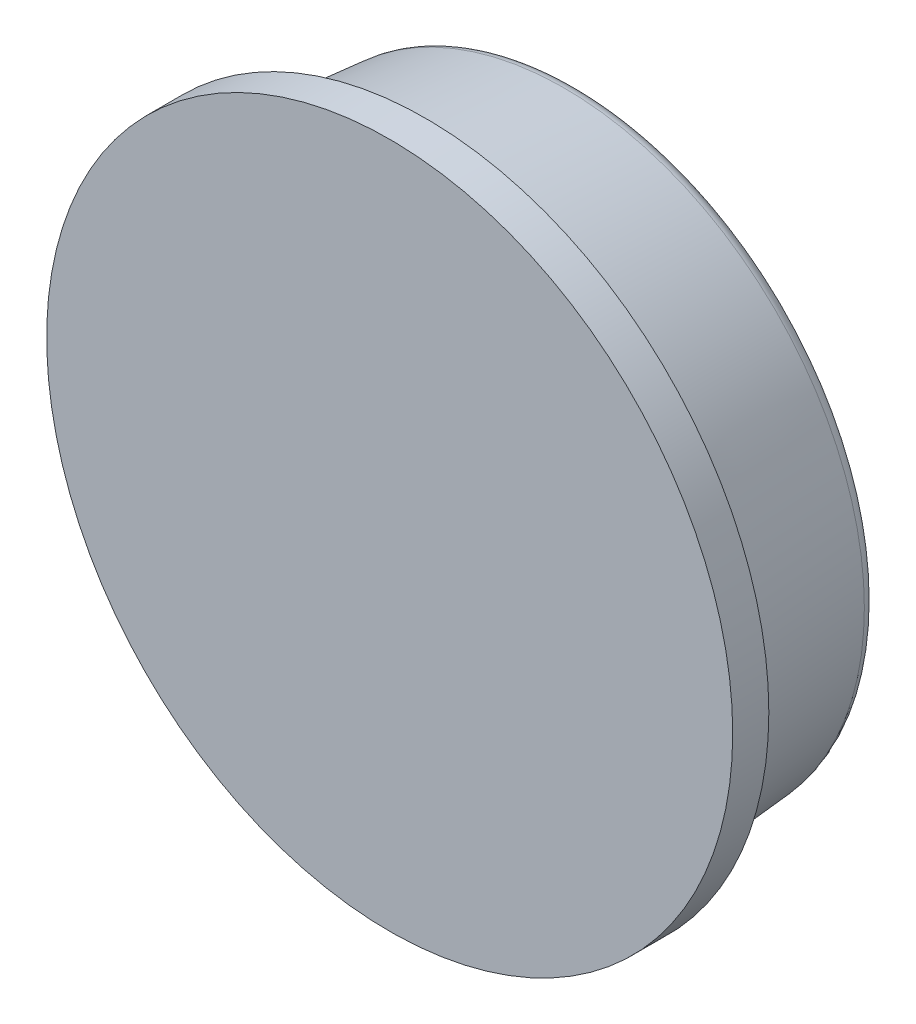
ISO-10303-21;
HEADER;
FILE_DESCRIPTION(('STEP AP214'),'2;1');
FILE_NAME('part.step','',(''),(''),'','','');
FILE_SCHEMA(('AUTOMOTIVE_DESIGN { 1 0 10303 214 1 1 1 1 }'));
ENDSEC;
DATA;
#1=APPLICATION_CONTEXT('core data for automotive mechanical design processes');
#2=APPLICATION_PROTOCOL_DEFINITION('international standard','automotive_design',2000,#1);
#3=PRODUCT_CONTEXT('',#1,'mechanical');
#4=PRODUCT('Part','Part','',(#3));
#5=PRODUCT_RELATED_PRODUCT_CATEGORY('part','',(#4));
#6=PRODUCT_DEFINITION_FORMATION('','',#4);
#7=PRODUCT_DEFINITION_CONTEXT('part definition',#1,'design');
#8=PRODUCT_DEFINITION('design','',#6,#7);
#9=PRODUCT_DEFINITION_SHAPE('','',#8);
#10=(LENGTH_UNIT() NAMED_UNIT(*) SI_UNIT(.MILLI.,.METRE.));
#11=(NAMED_UNIT(*) PLANE_ANGLE_UNIT() SI_UNIT($,.RADIAN.));
#12=(NAMED_UNIT(*) SI_UNIT($,.STERADIAN.) SOLID_ANGLE_UNIT());
#13=UNCERTAINTY_MEASURE_WITH_UNIT(LENGTH_MEASURE(1.E-05),#10,'distance_accuracy_value','');
#14=(GEOMETRIC_REPRESENTATION_CONTEXT(3) GLOBAL_UNCERTAINTY_ASSIGNED_CONTEXT((#13)) GLOBAL_UNIT_ASSIGNED_CONTEXT((#10,
#11,#12)) REPRESENTATION_CONTEXT('',''));
#15=CARTESIAN_POINT('',(0.,0.,0.));
#16=DIRECTION('',(0.,0.,1.));
#17=DIRECTION('',(1.,0.,0.));
#18=AXIS2_PLACEMENT_3D('',#15,#16,#17);
#19=CARTESIAN_POINT('',(0.,0.,2.667));
#20=DIRECTION('',(0.,0.,1.));
#21=DIRECTION('',(1.,0.,0.));
#22=AXIS2_PLACEMENT_3D('',#19,#20,#21);
#23=CYLINDRICAL_SURFACE('',#22,6.0325);
#24=CARTESIAN_POINT('',(0.,0.,2.667));
#25=DIRECTION('',(0.,0.,1.));
#26=DIRECTION('',(1.,0.,0.));
#27=AXIS2_PLACEMENT_3D('',#24,#25,#26);
#28=CIRCLE('',#27,6.0325);
#29=CARTESIAN_POINT('',(6.0325,0.,2.667));
#30=VERTEX_POINT('',#29);
#31=EDGE_CURVE('E54',#30,#30,#28,.T.);
#32=ORIENTED_EDGE('',*,*,#31,.T.);
#33=EDGE_LOOP('',(#32));
#34=FACE_BOUND('',#33,.T.);
#35=CARTESIAN_POINT('',(0.,0.,3.302));
#36=DIRECTION('',(0.,0.,1.));
#37=DIRECTION('',(1.,0.,0.));
#38=AXIS2_PLACEMENT_3D('',#35,#36,#37);
#39=CIRCLE('',#38,6.0325);
#40=CARTESIAN_POINT('',(6.0325,0.,3.302));
#41=VERTEX_POINT('',#40);
#42=EDGE_CURVE('E58',#41,#41,#39,.T.);
#43=ORIENTED_EDGE('',*,*,#42,.F.);
#44=EDGE_LOOP('',(#43));
#45=FACE_BOUND('',#44,.T.);
#46=ADVANCED_FACE('F43',(#34,#45),#23,.T.);
#47=CARTESIAN_POINT('',(0.,0.,2.667));
#48=DIRECTION('',(0.,0.,1.));
#49=DIRECTION('',(1.,0.,0.));
#50=AXIS2_PLACEMENT_3D('',#47,#48,#49);
#51=PLANE('',#50);
#52=CARTESIAN_POINT('',(0.,0.,2.667));
#53=DIRECTION('',(0.,0.,-1.));
#54=DIRECTION('',(-1.,0.,0.));
#55=AXIS2_PLACEMENT_3D('',#52,#53,#54);
#56=CIRCLE('',#55,5.4864);
#57=CARTESIAN_POINT('',(-5.4864,0.,2.667));
#58=VERTEX_POINT('',#57);
#59=EDGE_CURVE('E62',#58,#58,#56,.T.);
#60=ORIENTED_EDGE('',*,*,#59,.F.);
#61=EDGE_LOOP('',(#60));
#62=FACE_BOUND('',#61,.T.);
#63=ORIENTED_EDGE('',*,*,#31,.F.);
#64=EDGE_LOOP('',(#63));
#65=FACE_BOUND('',#64,.T.);
#66=ADVANCED_FACE('F69',(#62,#65),#51,.F.);
#67=CARTESIAN_POINT('',(0.,0.,3.302));
#68=DIRECTION('',(0.,0.,1.));
#69=DIRECTION('',(1.,0.,0.));
#70=AXIS2_PLACEMENT_3D('',#67,#68,#69);
#71=PLANE('',#70);
#72=ORIENTED_EDGE('',*,*,#42,.T.);
#73=EDGE_LOOP('',(#72));
#74=FACE_BOUND('',#73,.T.);
#75=ADVANCED_FACE('F72',(#74),#71,.T.);
#76=CARTESIAN_POINT('',(0.,0.,0.));
#77=DIRECTION('',(0.,0.,1.));
#78=DIRECTION('',(1.,0.,0.));
#79=AXIS2_PLACEMENT_3D('',#76,#77,#78);
#80=PLANE('',#79);
#81=CARTESIAN_POINT('',(0.,0.,0.));
#82=DIRECTION('',(0.,0.,1.));
#83=DIRECTION('',(1.,0.,0.));
#84=AXIS2_PLACEMENT_3D('',#81,#82,#83);
#85=CIRCLE('',#84,5.02464007486608);
#86=CARTESIAN_POINT('',(5.02464007486608,0.,0.));
#87=VERTEX_POINT('',#86);
#88=EDGE_CURVE('E11',#87,#87,#85,.F.);
#89=ORIENTED_EDGE('',*,*,#88,.T.);
#90=EDGE_LOOP('',(#89));
#91=FACE_BOUND('',#90,.T.);
#92=ADVANCED_FACE('F81',(#91),#80,.F.);
#93=CARTESIAN_POINT('',(0.,0.,0.));
#94=DIRECTION('',(0.,0.,1.));
#95=DIRECTION('',(1.,0.,0.));
#96=AXIS2_PLACEMENT_3D('',#93,#94,#95);
#97=CONICAL_SURFACE('',#96,5.2578,0.0855052936782046);
#98=CARTESIAN_POINT('',(0.,0.,0.232308110098005));
#99=DIRECTION('',(0.,0.,1.));
#100=DIRECTION('',(1.,0.,0.));
#101=AXIS2_PLACEMENT_3D('',#98,#99,#100);
#102=CIRCLE('',#101,5.27771212372269);
#103=CARTESIAN_POINT('',(5.27771212372269,0.,0.232308110098005));
#104=VERTEX_POINT('',#103);
#105=EDGE_CURVE('E50',#104,#104,#102,.T.);
#106=ORIENTED_EDGE('',*,*,#105,.T.);
#107=EDGE_LOOP('',(#106));
#108=FACE_BOUND('',#107,.T.);
#109=ORIENTED_EDGE('',*,*,#59,.T.);
#110=EDGE_LOOP('',(#109));
#111=FACE_BOUND('',#110,.T.);
#112=ADVANCED_FACE('F67',(#108,#111),#97,.T.);
#113=CARTESIAN_POINT('',(0.,0.,0.254));
#114=DIRECTION('',(0.,0.,1.));
#115=DIRECTION('',(1.,0.,0.));
#116=AXIS2_PLACEMENT_3D('',#113,#114,#115);
#117=TOROIDAL_SURFACE('',#116,5.02464007486608,0.254);
#118=ORIENTED_EDGE('',*,*,#88,.F.);
#119=EDGE_LOOP('',(#118));
#120=FACE_BOUND('',#119,.T.);
#121=ORIENTED_EDGE('',*,*,#105,.F.);
#122=EDGE_LOOP('',(#121));
#123=FACE_BOUND('',#122,.T.);
#124=ADVANCED_FACE('F45',(#120,#123),#117,.T.);
#125=CLOSED_SHELL('',(#46,#66,#75,#92,#112,#124));
#126=MANIFOLD_SOLID_BREP('B2',#125);
#127=ADVANCED_BREP_SHAPE_REPRESENTATION('',(#18,#126),#14);
#128=SHAPE_DEFINITION_REPRESENTATION(#9,#127);
ENDSEC;
END-ISO-10303-21;
